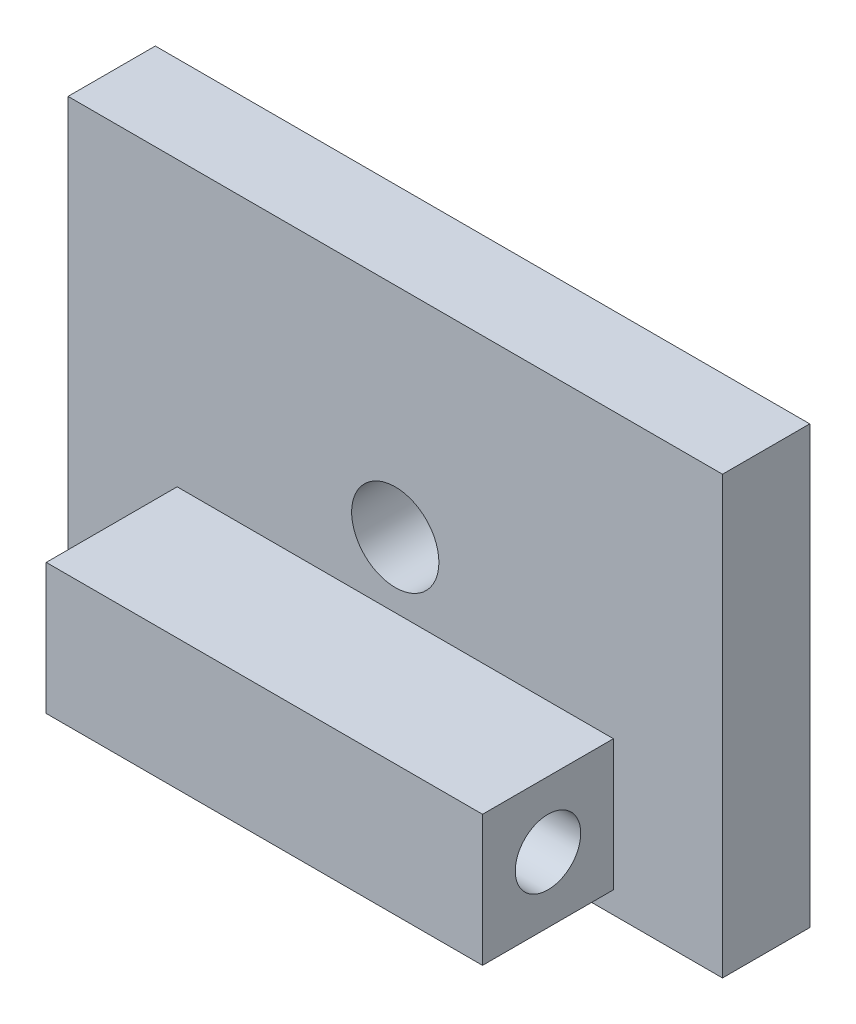
ISO-10303-21;
HEADER;
FILE_DESCRIPTION(('STEP AP214'),'2;1');
FILE_NAME('part.step','',(''),(''),'','','');
FILE_SCHEMA(('AUTOMOTIVE_DESIGN { 1 0 10303 214 1 1 1 1 }'));
ENDSEC;
DATA;
#1=APPLICATION_CONTEXT('core data for automotive mechanical design processes');
#2=APPLICATION_PROTOCOL_DEFINITION('international standard','automotive_design',2000,#1);
#3=PRODUCT_CONTEXT('',#1,'mechanical');
#4=PRODUCT('Part','Part','',(#3));
#5=PRODUCT_RELATED_PRODUCT_CATEGORY('part','',(#4));
#6=PRODUCT_DEFINITION_FORMATION('','',#4);
#7=PRODUCT_DEFINITION_CONTEXT('part definition',#1,'design');
#8=PRODUCT_DEFINITION('design','',#6,#7);
#9=PRODUCT_DEFINITION_SHAPE('','',#8);
#10=(LENGTH_UNIT() NAMED_UNIT(*) SI_UNIT(.MILLI.,.METRE.));
#11=(NAMED_UNIT(*) PLANE_ANGLE_UNIT() SI_UNIT($,.RADIAN.));
#12=(NAMED_UNIT(*) SI_UNIT($,.STERADIAN.) SOLID_ANGLE_UNIT());
#13=UNCERTAINTY_MEASURE_WITH_UNIT(LENGTH_MEASURE(1.E-05),#10,'distance_accuracy_value','');
#14=(GEOMETRIC_REPRESENTATION_CONTEXT(3) GLOBAL_UNCERTAINTY_ASSIGNED_CONTEXT((#13)) GLOBAL_UNIT_ASSIGNED_CONTEXT((#10,
#11,#12)) REPRESENTATION_CONTEXT('',''));
#15=CARTESIAN_POINT('',(0.,0.,0.));
#16=DIRECTION('',(0.,0.,1.));
#17=DIRECTION('',(1.,0.,0.));
#18=AXIS2_PLACEMENT_3D('',#15,#16,#17);
#19=CARTESIAN_POINT('',(0.,0.,4.));
#20=DIRECTION('',(0.,0.,1.));
#21=DIRECTION('',(1.,0.,0.));
#22=AXIS2_PLACEMENT_3D('',#19,#20,#21);
#23=PLANE('',#22);
#24=DIRECTION('',(0.,1.,0.));
#25=VECTOR('',#24,1.);
#26=CARTESIAN_POINT('',(15.,10.,4.));
#27=LINE('',#26,#25);
#28=CARTESIAN_POINT('',(15.,-10.,4.));
#29=VERTEX_POINT('',#28);
#30=CARTESIAN_POINT('',(15.,10.,4.));
#31=VERTEX_POINT('',#30);
#32=EDGE_CURVE('E157',#29,#31,#27,.T.);
#33=ORIENTED_EDGE('',*,*,#32,.T.);
#34=DIRECTION('',(-1.,0.,0.));
#35=VECTOR('',#34,1.);
#36=CARTESIAN_POINT('',(-15.,10.,4.));
#37=LINE('',#36,#35);
#38=CARTESIAN_POINT('',(-15.,10.,4.));
#39=VERTEX_POINT('',#38);
#40=EDGE_CURVE('E86',#31,#39,#37,.T.);
#41=ORIENTED_EDGE('',*,*,#40,.T.);
#42=DIRECTION('',(0.,-1.,0.));
#43=VECTOR('',#42,1.);
#44=CARTESIAN_POINT('',(-15.,10.,4.));
#45=LINE('',#44,#43);
#46=CARTESIAN_POINT('',(-15.,-10.,4.));
#47=VERTEX_POINT('',#46);
#48=EDGE_CURVE('E160',#39,#47,#45,.T.);
#49=ORIENTED_EDGE('',*,*,#48,.T.);
#50=DIRECTION('',(1.,0.,0.));
#51=VECTOR('',#50,1.);
#52=CARTESIAN_POINT('',(-15.,-10.,4.));
#53=LINE('',#52,#51);
#54=EDGE_CURVE('E58',#47,#29,#53,.T.);
#55=ORIENTED_EDGE('',*,*,#54,.T.);
#56=EDGE_LOOP('',(#33,#41,#49,#55));
#57=FACE_BOUND('',#56,.T.);
#58=CARTESIAN_POINT('',(0.,0.,4.));
#59=DIRECTION('',(0.,0.,1.));
#60=DIRECTION('',(1.,0.,0.));
#61=AXIS2_PLACEMENT_3D('',#58,#59,#60);
#62=CIRCLE('',#61,2.);
#63=CARTESIAN_POINT('',(2.,0.,4.));
#64=VERTEX_POINT('',#63);
#65=EDGE_CURVE('E151',#64,#64,#62,.T.);
#66=ORIENTED_EDGE('',*,*,#65,.F.);
#67=EDGE_LOOP('',(#66));
#68=FACE_BOUND('',#67,.T.);
#69=DIRECTION('',(0.,-1.,0.));
#70=VECTOR('',#69,1.);
#71=CARTESIAN_POINT('',(10.,-3.,4.));
#72=LINE('',#71,#70);
#73=CARTESIAN_POINT('',(10.,-3.,4.));
#74=VERTEX_POINT('',#73);
#75=CARTESIAN_POINT('',(10.,-9.,4.));
#76=VERTEX_POINT('',#75);
#77=EDGE_CURVE('E142',#74,#76,#72,.T.);
#78=ORIENTED_EDGE('',*,*,#77,.T.);
#79=DIRECTION('',(1.,0.,0.));
#80=VECTOR('',#79,1.);
#81=CARTESIAN_POINT('',(-10.,-9.,4.));
#82=LINE('',#81,#80);
#83=CARTESIAN_POINT('',(-10.,-9.,4.));
#84=VERTEX_POINT('',#83);
#85=EDGE_CURVE('E126',#84,#76,#82,.T.);
#86=ORIENTED_EDGE('',*,*,#85,.F.);
#87=DIRECTION('',(0.,-1.,0.));
#88=VECTOR('',#87,1.);
#89=CARTESIAN_POINT('',(-10.,-3.,4.));
#90=LINE('',#89,#88);
#91=CARTESIAN_POINT('',(-10.,-3.,4.));
#92=VERTEX_POINT('',#91);
#93=EDGE_CURVE('E120',#92,#84,#90,.T.);
#94=ORIENTED_EDGE('',*,*,#93,.F.);
#95=DIRECTION('',(1.,0.,0.));
#96=VECTOR('',#95,1.);
#97=CARTESIAN_POINT('',(-10.,-3.,4.));
#98=LINE('',#97,#96);
#99=EDGE_CURVE('E49',#92,#74,#98,.T.);
#100=ORIENTED_EDGE('',*,*,#99,.T.);
#101=EDGE_LOOP('',(#78,#86,#94,#100));
#102=FACE_BOUND('',#101,.T.);
#103=ADVANCED_FACE('F33',(#57,#68,#102),#23,.T.);
#104=CARTESIAN_POINT('',(0.,0.,0.));
#105=DIRECTION('',(0.,0.,1.));
#106=DIRECTION('',(1.,0.,0.));
#107=AXIS2_PLACEMENT_3D('',#104,#105,#106);
#108=PLANE('',#107);
#109=DIRECTION('',(0.,1.,0.));
#110=VECTOR('',#109,1.);
#111=CARTESIAN_POINT('',(15.,10.,0.));
#112=LINE('',#111,#110);
#113=CARTESIAN_POINT('',(15.,-10.,0.));
#114=VERTEX_POINT('',#113);
#115=CARTESIAN_POINT('',(15.,10.,0.));
#116=VERTEX_POINT('',#115);
#117=EDGE_CURVE('E154',#114,#116,#112,.T.);
#118=ORIENTED_EDGE('',*,*,#117,.F.);
#119=DIRECTION('',(1.,0.,0.));
#120=VECTOR('',#119,1.);
#121=CARTESIAN_POINT('',(-15.,-10.,0.));
#122=LINE('',#121,#120);
#123=CARTESIAN_POINT('',(-15.,-10.,0.));
#124=VERTEX_POINT('',#123);
#125=EDGE_CURVE('E79',#124,#114,#122,.T.);
#126=ORIENTED_EDGE('',*,*,#125,.F.);
#127=DIRECTION('',(0.,-1.,0.));
#128=VECTOR('',#127,1.);
#129=CARTESIAN_POINT('',(-15.,10.,0.));
#130=LINE('',#129,#128);
#131=CARTESIAN_POINT('',(-15.,10.,0.));
#132=VERTEX_POINT('',#131);
#133=EDGE_CURVE('E168',#132,#124,#130,.T.);
#134=ORIENTED_EDGE('',*,*,#133,.F.);
#135=DIRECTION('',(-1.,0.,0.));
#136=VECTOR('',#135,1.);
#137=CARTESIAN_POINT('',(-15.,10.,0.));
#138=LINE('',#137,#136);
#139=EDGE_CURVE('E166',#116,#132,#138,.T.);
#140=ORIENTED_EDGE('',*,*,#139,.F.);
#141=EDGE_LOOP('',(#118,#126,#134,#140));
#142=FACE_BOUND('',#141,.T.);
#143=CARTESIAN_POINT('',(0.,0.,0.));
#144=DIRECTION('',(0.,0.,1.));
#145=DIRECTION('',(1.,0.,0.));
#146=AXIS2_PLACEMENT_3D('',#143,#144,#145);
#147=CIRCLE('',#146,2.);
#148=CARTESIAN_POINT('',(2.,0.,0.));
#149=VERTEX_POINT('',#148);
#150=EDGE_CURVE('E130',#149,#149,#147,.T.);
#151=ORIENTED_EDGE('',*,*,#150,.T.);
#152=EDGE_LOOP('',(#151));
#153=FACE_BOUND('',#152,.T.);
#154=ADVANCED_FACE('F182',(#142,#153),#108,.F.);
#155=CARTESIAN_POINT('',(15.,10.,4.));
#156=DIRECTION('',(-1.,0.,0.));
#157=DIRECTION('',(0.,-1.,0.));
#158=AXIS2_PLACEMENT_3D('',#155,#156,#157);
#159=PLANE('',#158);
#160=ORIENTED_EDGE('',*,*,#117,.T.);
#161=DIRECTION('',(0.,0.,-1.));
#162=VECTOR('',#161,1.);
#163=CARTESIAN_POINT('',(15.,10.,4.));
#164=LINE('',#163,#162);
#165=EDGE_CURVE('E11',#31,#116,#164,.T.);
#166=ORIENTED_EDGE('',*,*,#165,.F.);
#167=ORIENTED_EDGE('',*,*,#32,.F.);
#168=DIRECTION('',(0.,0.,-1.));
#169=VECTOR('',#168,1.);
#170=CARTESIAN_POINT('',(15.,-10.,4.));
#171=LINE('',#170,#169);
#172=EDGE_CURVE('E163',#29,#114,#171,.T.);
#173=ORIENTED_EDGE('',*,*,#172,.T.);
#174=EDGE_LOOP('',(#160,#166,#167,#173));
#175=FACE_BOUND('',#174,.T.);
#176=ADVANCED_FACE('F35',(#175),#159,.F.);
#177=CARTESIAN_POINT('',(-15.,10.,4.));
#178=DIRECTION('',(0.,-1.,0.));
#179=DIRECTION('',(0.,0.,-1.));
#180=AXIS2_PLACEMENT_3D('',#177,#178,#179);
#181=PLANE('',#180);
#182=ORIENTED_EDGE('',*,*,#139,.T.);
#183=DIRECTION('',(0.,0.,-1.));
#184=VECTOR('',#183,1.);
#185=CARTESIAN_POINT('',(-15.,10.,4.));
#186=LINE('',#185,#184);
#187=EDGE_CURVE('E42',#39,#132,#186,.T.);
#188=ORIENTED_EDGE('',*,*,#187,.F.);
#189=ORIENTED_EDGE('',*,*,#40,.F.);
#190=ORIENTED_EDGE('',*,*,#165,.T.);
#191=EDGE_LOOP('',(#182,#188,#189,#190));
#192=FACE_BOUND('',#191,.T.);
#193=ADVANCED_FACE('F197',(#192),#181,.F.);
#194=CARTESIAN_POINT('',(-15.,10.,4.));
#195=DIRECTION('',(1.,0.,0.));
#196=DIRECTION('',(0.,1.,0.));
#197=AXIS2_PLACEMENT_3D('',#194,#195,#196);
#198=PLANE('',#197);
#199=ORIENTED_EDGE('',*,*,#133,.T.);
#200=DIRECTION('',(0.,0.,-1.));
#201=VECTOR('',#200,1.);
#202=CARTESIAN_POINT('',(-15.,-10.,4.));
#203=LINE('',#202,#201);
#204=EDGE_CURVE('E172',#47,#124,#203,.T.);
#205=ORIENTED_EDGE('',*,*,#204,.F.);
#206=ORIENTED_EDGE('',*,*,#48,.F.);
#207=ORIENTED_EDGE('',*,*,#187,.T.);
#208=EDGE_LOOP('',(#199,#205,#206,#207));
#209=FACE_BOUND('',#208,.T.);
#210=ADVANCED_FACE('F178',(#209),#198,.F.);
#211=CARTESIAN_POINT('',(-15.,-10.,4.));
#212=DIRECTION('',(0.,1.,0.));
#213=DIRECTION('',(0.,0.,1.));
#214=AXIS2_PLACEMENT_3D('',#211,#212,#213);
#215=PLANE('',#214);
#216=ORIENTED_EDGE('',*,*,#125,.T.);
#217=ORIENTED_EDGE('',*,*,#172,.F.);
#218=ORIENTED_EDGE('',*,*,#54,.F.);
#219=ORIENTED_EDGE('',*,*,#204,.T.);
#220=EDGE_LOOP('',(#216,#217,#218,#219));
#221=FACE_BOUND('',#220,.T.);
#222=ADVANCED_FACE('F187',(#221),#215,.F.);
#223=CARTESIAN_POINT('',(0.,0.,4.));
#224=DIRECTION('',(0.,0.,-1.));
#225=DIRECTION('',(-1.,0.,0.));
#226=AXIS2_PLACEMENT_3D('',#223,#224,#225);
#227=CYLINDRICAL_SURFACE('',#226,2.);
#228=ORIENTED_EDGE('',*,*,#65,.T.);
#229=EDGE_LOOP('',(#228));
#230=FACE_BOUND('',#229,.T.);
#231=ORIENTED_EDGE('',*,*,#150,.F.);
#232=EDGE_LOOP('',(#231));
#233=FACE_BOUND('',#232,.T.);
#234=ADVANCED_FACE('F189',(#230,#233),#227,.F.);
#235=CARTESIAN_POINT('',(-10.,-9.,10.));
#236=DIRECTION('',(0.,1.,0.));
#237=DIRECTION('',(0.,0.,1.));
#238=AXIS2_PLACEMENT_3D('',#235,#236,#237);
#239=PLANE('',#238);
#240=ORIENTED_EDGE('',*,*,#85,.T.);
#241=DIRECTION('',(0.,0.,-1.));
#242=VECTOR('',#241,1.);
#243=CARTESIAN_POINT('',(10.,-9.,10.));
#244=LINE('',#243,#242);
#245=CARTESIAN_POINT('',(10.,-9.,10.));
#246=VERTEX_POINT('',#245);
#247=EDGE_CURVE('E123',#246,#76,#244,.T.);
#248=ORIENTED_EDGE('',*,*,#247,.F.);
#249=DIRECTION('',(1.,0.,0.));
#250=VECTOR('',#249,1.);
#251=CARTESIAN_POINT('',(-10.,-9.,10.));
#252=LINE('',#251,#250);
#253=CARTESIAN_POINT('',(-10.,-9.,10.));
#254=VERTEX_POINT('',#253);
#255=EDGE_CURVE('E108',#254,#246,#252,.T.);
#256=ORIENTED_EDGE('',*,*,#255,.F.);
#257=DIRECTION('',(0.,0.,-1.));
#258=VECTOR('',#257,1.);
#259=CARTESIAN_POINT('',(-10.,-9.,10.));
#260=LINE('',#259,#258);
#261=EDGE_CURVE('E140',#254,#84,#260,.T.);
#262=ORIENTED_EDGE('',*,*,#261,.T.);
#263=EDGE_LOOP('',(#240,#248,#256,#262));
#264=FACE_BOUND('',#263,.T.);
#265=ADVANCED_FACE('F124',(#264),#239,.F.);
#266=CARTESIAN_POINT('',(10.,-3.,10.));
#267=DIRECTION('',(1.,0.,0.));
#268=DIRECTION('',(0.,0.,-1.));
#269=AXIS2_PLACEMENT_3D('',#266,#267,#268);
#270=PLANE('',#269);
#271=CARTESIAN_POINT('',(10.,-6.,7.));
#272=DIRECTION('',(1.,0.,0.));
#273=DIRECTION('',(0.,0.,-1.));
#274=AXIS2_PLACEMENT_3D('',#271,#272,#273);
#275=CIRCLE('',#274,1.5);
#276=CARTESIAN_POINT('',(10.,-6.,5.5));
#277=VERTEX_POINT('',#276);
#278=EDGE_CURVE('E240',#277,#277,#275,.T.);
#279=ORIENTED_EDGE('',*,*,#278,.F.);
#280=EDGE_LOOP('',(#279));
#281=FACE_BOUND('',#280,.T.);
#282=ORIENTED_EDGE('',*,*,#77,.F.);
#283=DIRECTION('',(0.,0.,-1.));
#284=VECTOR('',#283,1.);
#285=CARTESIAN_POINT('',(10.,-3.,10.));
#286=LINE('',#285,#284);
#287=CARTESIAN_POINT('',(10.,-3.,10.));
#288=VERTEX_POINT('',#287);
#289=EDGE_CURVE('E131',#288,#74,#286,.T.);
#290=ORIENTED_EDGE('',*,*,#289,.F.);
#291=DIRECTION('',(0.,-1.,0.));
#292=VECTOR('',#291,1.);
#293=CARTESIAN_POINT('',(10.,-3.,10.));
#294=LINE('',#293,#292);
#295=EDGE_CURVE('E113',#288,#246,#294,.T.);
#296=ORIENTED_EDGE('',*,*,#295,.T.);
#297=ORIENTED_EDGE('',*,*,#247,.T.);
#298=EDGE_LOOP('',(#282,#290,#296,#297));
#299=FACE_BOUND('',#298,.T.);
#300=ADVANCED_FACE('F133',(#281,#299),#270,.T.);
#301=CARTESIAN_POINT('',(-10.,-3.,10.));
#302=DIRECTION('',(0.,1.,0.));
#303=DIRECTION('',(0.,0.,1.));
#304=AXIS2_PLACEMENT_3D('',#301,#302,#303);
#305=PLANE('',#304);
#306=ORIENTED_EDGE('',*,*,#99,.F.);
#307=DIRECTION('',(0.,0.,-1.));
#308=VECTOR('',#307,1.);
#309=CARTESIAN_POINT('',(-10.,-3.,10.));
#310=LINE('',#309,#308);
#311=CARTESIAN_POINT('',(-10.,-3.,10.));
#312=VERTEX_POINT('',#311);
#313=EDGE_CURVE('E148',#312,#92,#310,.T.);
#314=ORIENTED_EDGE('',*,*,#313,.F.);
#315=DIRECTION('',(1.,0.,0.));
#316=VECTOR('',#315,1.);
#317=CARTESIAN_POINT('',(-10.,-3.,10.));
#318=LINE('',#317,#316);
#319=EDGE_CURVE('E134',#312,#288,#318,.T.);
#320=ORIENTED_EDGE('',*,*,#319,.T.);
#321=ORIENTED_EDGE('',*,*,#289,.T.);
#322=EDGE_LOOP('',(#306,#314,#320,#321));
#323=FACE_BOUND('',#322,.T.);
#324=ADVANCED_FACE('F211',(#323),#305,.T.);
#325=CARTESIAN_POINT('',(-10.,-3.,10.));
#326=DIRECTION('',(1.,0.,0.));
#327=DIRECTION('',(0.,0.,-1.));
#328=AXIS2_PLACEMENT_3D('',#325,#326,#327);
#329=PLANE('',#328);
#330=CARTESIAN_POINT('',(-10.,-6.,7.));
#331=DIRECTION('',(1.,0.,0.));
#332=DIRECTION('',(0.,0.,-1.));
#333=AXIS2_PLACEMENT_3D('',#330,#331,#332);
#334=CIRCLE('',#333,1.2);
#335=CARTESIAN_POINT('',(-10.,-6.,5.8));
#336=VERTEX_POINT('',#335);
#337=EDGE_CURVE('E37',#336,#336,#334,.T.);
#338=ORIENTED_EDGE('',*,*,#337,.T.);
#339=EDGE_LOOP('',(#338));
#340=FACE_BOUND('',#339,.T.);
#341=ORIENTED_EDGE('',*,*,#93,.T.);
#342=ORIENTED_EDGE('',*,*,#261,.F.);
#343=DIRECTION('',(0.,-1.,0.));
#344=VECTOR('',#343,1.);
#345=CARTESIAN_POINT('',(-10.,-3.,10.));
#346=LINE('',#345,#344);
#347=EDGE_CURVE('E116',#312,#254,#346,.T.);
#348=ORIENTED_EDGE('',*,*,#347,.F.);
#349=ORIENTED_EDGE('',*,*,#313,.T.);
#350=EDGE_LOOP('',(#341,#342,#348,#349));
#351=FACE_BOUND('',#350,.T.);
#352=ADVANCED_FACE('F215',(#340,#351),#329,.F.);
#353=CARTESIAN_POINT('',(0.,0.,10.));
#354=DIRECTION('',(0.,0.,-1.));
#355=DIRECTION('',(-1.,0.,0.));
#356=AXIS2_PLACEMENT_3D('',#353,#354,#355);
#357=PLANE('',#356);
#358=ORIENTED_EDGE('',*,*,#255,.T.);
#359=ORIENTED_EDGE('',*,*,#295,.F.);
#360=ORIENTED_EDGE('',*,*,#319,.F.);
#361=ORIENTED_EDGE('',*,*,#347,.T.);
#362=EDGE_LOOP('',(#358,#359,#360,#361));
#363=FACE_BOUND('',#362,.T.);
#364=ADVANCED_FACE('F110',(#363),#357,.F.);
#365=CARTESIAN_POINT('',(-8.00000000000001,-6.,7.));
#366=DIRECTION('',(1.,0.,0.));
#367=DIRECTION('',(0.,0.,-1.));
#368=AXIS2_PLACEMENT_3D('',#365,#366,#367);
#369=CYLINDRICAL_SURFACE('',#368,1.5);
#370=CARTESIAN_POINT('',(-8.00000000000001,-6.,7.));
#371=DIRECTION('',(1.,0.,0.));
#372=DIRECTION('',(0.,0.,-1.));
#373=AXIS2_PLACEMENT_3D('',#370,#371,#372);
#374=CIRCLE('',#373,1.5);
#375=CARTESIAN_POINT('',(-8.00000000000001,-6.,5.5));
#376=VERTEX_POINT('',#375);
#377=EDGE_CURVE('E143',#376,#376,#374,.T.);
#378=ORIENTED_EDGE('',*,*,#377,.F.);
#379=EDGE_LOOP('',(#378));
#380=FACE_BOUND('',#379,.T.);
#381=ORIENTED_EDGE('',*,*,#278,.T.);
#382=EDGE_LOOP('',(#381));
#383=FACE_BOUND('',#382,.T.);
#384=ADVANCED_FACE('F221',(#380,#383),#369,.F.);
#385=CARTESIAN_POINT('',(-8.00000000000001,-6.,7.));
#386=DIRECTION('',(1.,0.,0.));
#387=DIRECTION('',(0.,0.,-1.));
#388=AXIS2_PLACEMENT_3D('',#385,#386,#387);
#389=PLANE('',#388);
#390=CARTESIAN_POINT('',(-8.00000000000001,-6.,7.));
#391=DIRECTION('',(1.,0.,0.));
#392=DIRECTION('',(0.,0.,-1.));
#393=AXIS2_PLACEMENT_3D('',#390,#391,#392);
#394=CIRCLE('',#393,1.2);
#395=CARTESIAN_POINT('',(-8.00000000000001,-6.,5.8));
#396=VERTEX_POINT('',#395);
#397=EDGE_CURVE('E237',#396,#396,#394,.T.);
#398=ORIENTED_EDGE('',*,*,#397,.F.);
#399=EDGE_LOOP('',(#398));
#400=FACE_BOUND('',#399,.T.);
#401=ORIENTED_EDGE('',*,*,#377,.T.);
#402=EDGE_LOOP('',(#401));
#403=FACE_BOUND('',#402,.T.);
#404=ADVANCED_FACE('F224',(#400,#403),#389,.T.);
#405=CARTESIAN_POINT('',(-14.,-6.,7.));
#406=DIRECTION('',(1.,0.,0.));
#407=DIRECTION('',(0.,0.,-1.));
#408=AXIS2_PLACEMENT_3D('',#405,#406,#407);
#409=CYLINDRICAL_SURFACE('',#408,1.2);
#410=CARTESIAN_POINT('',(-8.00000000000001,-6.,5.8));
#411=CARTESIAN_POINT('',(-8.02083333333334,-6.,5.8));
#412=CARTESIAN_POINT('',(-8.04166666666668,-6.,5.8));
#413=CARTESIAN_POINT('',(-8.08333333333334,-6.,5.8));
#414=CARTESIAN_POINT('',(-8.10416666666668,-6.,5.8));
#415=CARTESIAN_POINT('',(-8.14583333333334,-6.,5.8));
#416=CARTESIAN_POINT('',(-8.16666666666668,-6.,5.8));
#417=CARTESIAN_POINT('',(-8.20833333333334,-6.,5.8));
#418=CARTESIAN_POINT('',(-8.22916666666667,-6.,5.8));
#419=CARTESIAN_POINT('',(-8.27083333333334,-6.,5.8));
#420=CARTESIAN_POINT('',(-8.29166666666667,-6.,5.8));
#421=CARTESIAN_POINT('',(-8.33333333333334,-6.,5.8));
#422=CARTESIAN_POINT('',(-8.35416666666667,-6.,5.8));
#423=CARTESIAN_POINT('',(-8.39583333333334,-6.,5.8));
#424=CARTESIAN_POINT('',(-8.41666666666667,-6.,5.8));
#425=CARTESIAN_POINT('',(-8.45833333333334,-6.,5.8));
#426=CARTESIAN_POINT('',(-8.47916666666667,-6.,5.8));
#427=CARTESIAN_POINT('',(-8.52083333333334,-6.,5.8));
#428=CARTESIAN_POINT('',(-8.54166666666667,-6.,5.8));
#429=CARTESIAN_POINT('',(-8.58333333333334,-6.,5.8));
#430=CARTESIAN_POINT('',(-8.60416666666667,-6.,5.8));
#431=CARTESIAN_POINT('',(-8.64583333333334,-6.,5.8));
#432=CARTESIAN_POINT('',(-8.66666666666667,-6.,5.8));
#433=CARTESIAN_POINT('',(-8.70833333333334,-6.,5.8));
#434=CARTESIAN_POINT('',(-8.72916666666667,-6.,5.8));
#435=CARTESIAN_POINT('',(-8.77083333333334,-6.,5.8));
#436=CARTESIAN_POINT('',(-8.79166666666667,-6.,5.8));
#437=CARTESIAN_POINT('',(-8.83333333333334,-6.,5.8));
#438=CARTESIAN_POINT('',(-8.85416666666667,-6.,5.8));
#439=CARTESIAN_POINT('',(-8.89583333333334,-6.,5.8));
#440=CARTESIAN_POINT('',(-8.91666666666667,-6.,5.8));
#441=CARTESIAN_POINT('',(-8.95833333333334,-6.,5.8));
#442=CARTESIAN_POINT('',(-8.97916666666667,-6.,5.8));
#443=CARTESIAN_POINT('',(-9.02083333333334,-6.,5.8));
#444=CARTESIAN_POINT('',(-9.04166666666667,-6.,5.8));
#445=CARTESIAN_POINT('',(-9.08333333333334,-6.,5.8));
#446=CARTESIAN_POINT('',(-9.10416666666667,-6.,5.8));
#447=CARTESIAN_POINT('',(-9.14583333333334,-6.,5.8));
#448=CARTESIAN_POINT('',(-9.16666666666667,-6.,5.8));
#449=CARTESIAN_POINT('',(-9.20833333333334,-6.,5.8));
#450=CARTESIAN_POINT('',(-9.22916666666667,-6.,5.8));
#451=CARTESIAN_POINT('',(-9.27083333333334,-6.,5.8));
#452=CARTESIAN_POINT('',(-9.29166666666667,-6.,5.8));
#453=CARTESIAN_POINT('',(-9.33333333333334,-6.,5.8));
#454=CARTESIAN_POINT('',(-9.35416666666667,-6.,5.8));
#455=CARTESIAN_POINT('',(-9.39583333333334,-6.,5.8));
#456=CARTESIAN_POINT('',(-9.41666666666667,-6.,5.8));
#457=CARTESIAN_POINT('',(-9.45833333333334,-6.,5.8));
#458=CARTESIAN_POINT('',(-9.47916666666667,-6.,5.8));
#459=CARTESIAN_POINT('',(-9.52083333333334,-6.,5.8));
#460=CARTESIAN_POINT('',(-9.54166666666667,-6.,5.8));
#461=CARTESIAN_POINT('',(-9.58333333333333,-6.,5.8));
#462=CARTESIAN_POINT('',(-9.60416666666667,-6.,5.8));
#463=CARTESIAN_POINT('',(-9.64583333333333,-6.,5.8));
#464=CARTESIAN_POINT('',(-9.66666666666667,-6.,5.8));
#465=CARTESIAN_POINT('',(-9.70833333333333,-6.,5.8));
#466=CARTESIAN_POINT('',(-9.72916666666667,-6.,5.8));
#467=CARTESIAN_POINT('',(-9.77083333333333,-6.,5.8));
#468=CARTESIAN_POINT('',(-9.79166666666667,-6.,5.8));
#469=CARTESIAN_POINT('',(-9.83333333333333,-6.,5.8));
#470=CARTESIAN_POINT('',(-9.85416666666667,-6.,5.8));
#471=CARTESIAN_POINT('',(-9.89583333333333,-6.,5.8));
#472=CARTESIAN_POINT('',(-9.91666666666667,-6.,5.8));
#473=CARTESIAN_POINT('',(-9.95833333333333,-6.,5.8));
#474=CARTESIAN_POINT('',(-9.97916666666667,-6.,5.8));
#475=CARTESIAN_POINT('',(-10.,-6.,5.8));
#476=B_SPLINE_CURVE_WITH_KNOTS('',3,(#410,#411,#412,#413,#414,#415,#416,#417,#418,#419,#420,
#421,#422,#423,#424,#425,#426,#427,#428,#429,#430,#431,#432,#433,#434,#435,#436,#437,#438,#439,
#440,#441,#442,#443,#444,#445,#446,#447,#448,#449,#450,#451,#452,#453,#454,#455,#456,#457,#458,
#459,#460,#461,#462,#463,#464,#465,#466,#467,#468,#469,#470,#471,#472,#473,#474,#475),
.UNSPECIFIED.,.F.,.F.,(4,2,2,2,2,2,2,2,2,2,2,2,2,2,2,2,2,2,2,2,2,2,2,2,2,2,2,2,2,2,2,2,4),(0.,
0.0625000000000001,0.124999999999998,0.187499999999998,0.249999999999997,0.312499999999997,
0.374999999999997,0.437499999999997,0.499999999999997,0.562499999999997,0.624999999999997,
0.687499999999997,0.749999999999997,0.812499999999996,0.874999999999996,0.937499999999994,
0.999999999999994,1.06249999999999,1.12499999999999,1.18749999999999,1.24999999999999,
1.31249999999999,1.37499999999999,1.43749999999999,1.49999999999999,1.56249999999999,
1.62499999999999,1.68749999999999,1.74999999999999,1.81249999999999,1.87499999999999,
1.93749999999999,1.99999999999999),.UNSPECIFIED.);
#477=EDGE_CURVE('BSEAM228',#396,#336,#476,.T.);
#478=ORIENTED_EDGE('',*,*,#397,.T.);
#479=ORIENTED_EDGE('',*,*,#337,.F.);
#480=ORIENTED_EDGE('',*,*,#477,.T.);
#481=ORIENTED_EDGE('',*,*,#477,.F.);
#482=EDGE_LOOP('',(#478,#480,#479,#481));
#483=FACE_BOUND('',#482,.T.);
#484=ADVANCED_FACE('F228',(#483),#409,.F.);
#485=CLOSED_SHELL('',(#103,#154,#176,#193,#210,#222,#234,#265,#300,#324,#352,#364,#384,#404,#484));
#486=MANIFOLD_SOLID_BREP('B2',#485);
#487=ADVANCED_BREP_SHAPE_REPRESENTATION('',(#18,#486),#14);
#488=SHAPE_DEFINITION_REPRESENTATION(#9,#487);
ENDSEC;
END-ISO-10303-21;
